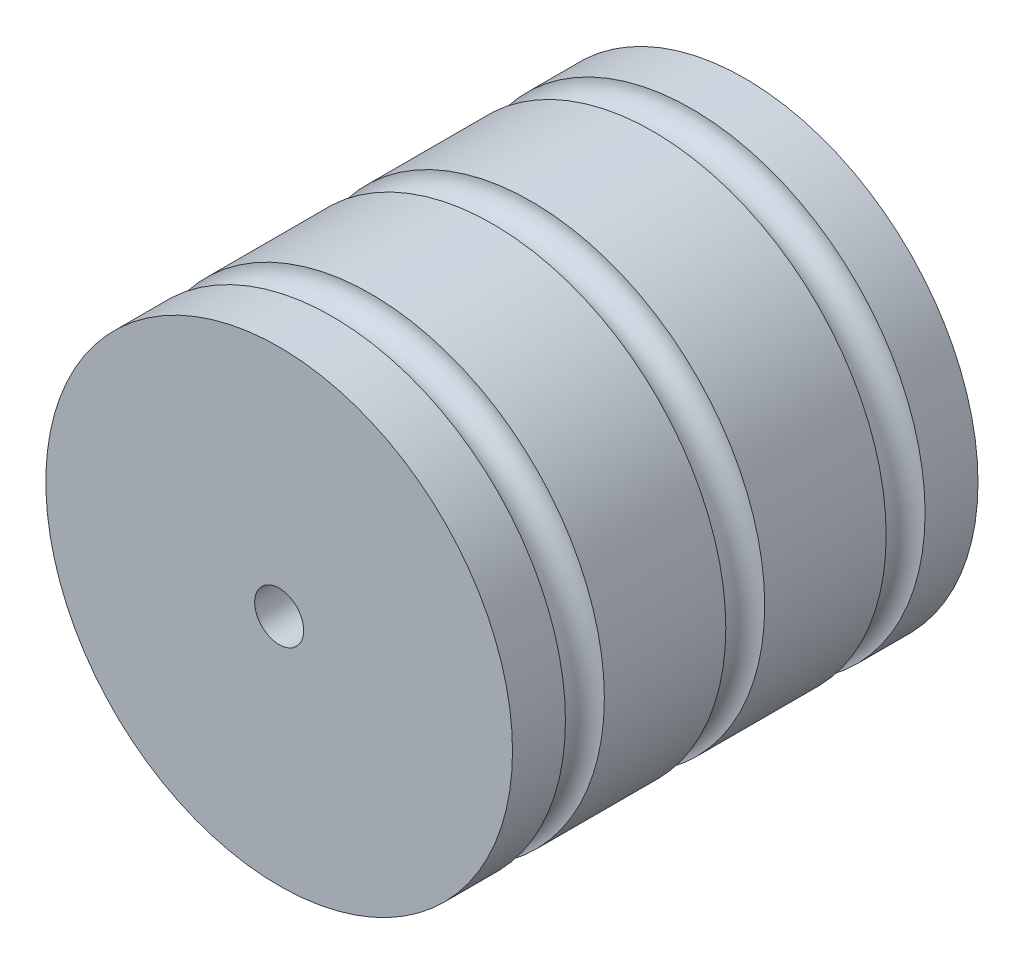
ISO-10303-21;
HEADER;
FILE_DESCRIPTION(('STEP AP214'),'2;1');
FILE_NAME('part.step','',(''),(''),'','','');
FILE_SCHEMA(('AUTOMOTIVE_DESIGN { 1 0 10303 214 1 1 1 1 }'));
ENDSEC;
DATA;
#1=APPLICATION_CONTEXT('core data for automotive mechanical design processes');
#2=APPLICATION_PROTOCOL_DEFINITION('international standard','automotive_design',2000,#1);
#3=PRODUCT_CONTEXT('',#1,'mechanical');
#4=PRODUCT('Part','Part','',(#3));
#5=PRODUCT_RELATED_PRODUCT_CATEGORY('part','',(#4));
#6=PRODUCT_DEFINITION_FORMATION('','',#4);
#7=PRODUCT_DEFINITION_CONTEXT('part definition',#1,'design');
#8=PRODUCT_DEFINITION('design','',#6,#7);
#9=PRODUCT_DEFINITION_SHAPE('','',#8);
#10=(LENGTH_UNIT() NAMED_UNIT(*) SI_UNIT(.MILLI.,.METRE.));
#11=(NAMED_UNIT(*) PLANE_ANGLE_UNIT() SI_UNIT($,.RADIAN.));
#12=(NAMED_UNIT(*) SI_UNIT($,.STERADIAN.) SOLID_ANGLE_UNIT());
#13=UNCERTAINTY_MEASURE_WITH_UNIT(LENGTH_MEASURE(1.E-05),#10,'distance_accuracy_value','');
#14=(GEOMETRIC_REPRESENTATION_CONTEXT(3) GLOBAL_UNCERTAINTY_ASSIGNED_CONTEXT((#13)) GLOBAL_UNIT_ASSIGNED_CONTEXT((#10,
#11,#12)) REPRESENTATION_CONTEXT('',''));
#15=CARTESIAN_POINT('',(0.,0.,0.));
#16=DIRECTION('',(0.,0.,1.));
#17=DIRECTION('',(1.,0.,0.));
#18=AXIS2_PLACEMENT_3D('',#15,#16,#17);
#19=CARTESIAN_POINT('',(0.,0.,0.));
#20=DIRECTION('',(0.,0.,1.));
#21=DIRECTION('',(1.,0.,0.));
#22=AXIS2_PLACEMENT_3D('',#19,#20,#21);
#23=CYLINDRICAL_SURFACE('',#22,38.1);
#24=CARTESIAN_POINT('',(0.,0.,-76.));
#25=DIRECTION('',(0.,0.,1.));
#26=DIRECTION('',(1.,0.,0.));
#27=AXIS2_PLACEMENT_3D('',#24,#25,#26);
#28=CIRCLE('',#27,38.1);
#29=CARTESIAN_POINT('',(38.1,0.,-76.));
#30=VERTEX_POINT('',#29);
#31=EDGE_CURVE('E10',#30,#30,#28,.T.);
#32=ORIENTED_EDGE('',*,*,#31,.T.);
#33=EDGE_LOOP('',(#32));
#34=FACE_BOUND('',#33,.T.);
#35=CARTESIAN_POINT('',(0.,0.,-67.3578022588215));
#36=DIRECTION('',(0.,0.,1.));
#37=DIRECTION('',(1.,0.,0.));
#38=AXIS2_PLACEMENT_3D('',#35,#36,#37);
#39=CIRCLE('',#38,38.1);
#40=CARTESIAN_POINT('',(38.1,0.,-67.3578022588215));
#41=VERTEX_POINT('',#40);
#42=EDGE_CURVE('E65',#41,#41,#39,.T.);
#43=ORIENTED_EDGE('',*,*,#42,.F.);
#44=EDGE_LOOP('',(#43));
#45=FACE_BOUND('',#44,.T.);
#46=ADVANCED_FACE('F31',(#34,#45),#23,.T.);
#47=CARTESIAN_POINT('',(4.,0.,-76.));
#48=DIRECTION('',(0.,0.,-1.));
#49=DIRECTION('',(-1.,0.,0.));
#50=AXIS2_PLACEMENT_3D('',#47,#48,#49);
#51=PLANE('',#50);
#52=CARTESIAN_POINT('',(0.,0.,-76.));
#53=DIRECTION('',(0.,0.,1.));
#54=DIRECTION('',(1.,0.,0.));
#55=AXIS2_PLACEMENT_3D('',#52,#53,#54);
#56=CIRCLE('',#55,4.);
#57=CARTESIAN_POINT('',(4.,0.,-76.));
#58=VERTEX_POINT('',#57);
#59=EDGE_CURVE('E37',#58,#58,#56,.T.);
#60=ORIENTED_EDGE('',*,*,#59,.T.);
#61=EDGE_LOOP('',(#60));
#62=FACE_BOUND('',#61,.T.);
#63=ORIENTED_EDGE('',*,*,#31,.F.);
#64=EDGE_LOOP('',(#63));
#65=FACE_BOUND('',#64,.T.);
#66=ADVANCED_FACE('F73',(#62,#65),#51,.T.);
#67=CARTESIAN_POINT('',(0.,0.,0.));
#68=DIRECTION('',(0.,0.,1.));
#69=DIRECTION('',(1.,0.,0.));
#70=AXIS2_PLACEMENT_3D('',#67,#68,#69);
#71=CYLINDRICAL_SURFACE('',#70,4.00000000000001);
#72=CARTESIAN_POINT('',(0.,0.,0.));
#73=DIRECTION('',(0.,0.,1.));
#74=DIRECTION('',(1.,0.,0.));
#75=AXIS2_PLACEMENT_3D('',#72,#73,#74);
#76=CIRCLE('',#75,4.00000000000001);
#77=CARTESIAN_POINT('',(4.00000000000001,0.,0.));
#78=VERTEX_POINT('',#77);
#79=EDGE_CURVE('E41',#78,#78,#76,.T.);
#80=ORIENTED_EDGE('',*,*,#79,.T.);
#81=EDGE_LOOP('',(#80));
#82=FACE_BOUND('',#81,.T.);
#83=ORIENTED_EDGE('',*,*,#59,.F.);
#84=EDGE_LOOP('',(#83));
#85=FACE_BOUND('',#84,.T.);
#86=ADVANCED_FACE('F77',(#82,#85),#71,.F.);
#87=CARTESIAN_POINT('',(4.00000000000001,0.,0.));
#88=DIRECTION('',(0.,0.,1.));
#89=DIRECTION('',(1.,0.,0.));
#90=AXIS2_PLACEMENT_3D('',#87,#88,#89);
#91=PLANE('',#90);
#92=CARTESIAN_POINT('',(0.,0.,0.));
#93=DIRECTION('',(0.,0.,1.));
#94=DIRECTION('',(1.,0.,0.));
#95=AXIS2_PLACEMENT_3D('',#92,#93,#94);
#96=CIRCLE('',#95,38.1);
#97=CARTESIAN_POINT('',(38.1,0.,0.));
#98=VERTEX_POINT('',#97);
#99=EDGE_CURVE('E45',#98,#98,#96,.T.);
#100=ORIENTED_EDGE('',*,*,#99,.T.);
#101=EDGE_LOOP('',(#100));
#102=FACE_BOUND('',#101,.T.);
#103=ORIENTED_EDGE('',*,*,#79,.F.);
#104=EDGE_LOOP('',(#103));
#105=FACE_BOUND('',#104,.T.);
#106=ADVANCED_FACE('F81',(#102,#105),#91,.T.);
#107=CARTESIAN_POINT('',(0.,0.,0.));
#108=DIRECTION('',(0.,0.,1.));
#109=DIRECTION('',(1.,0.,0.));
#110=AXIS2_PLACEMENT_3D('',#107,#108,#109);
#111=CYLINDRICAL_SURFACE('',#110,38.1);
#112=CARTESIAN_POINT('',(0.,0.,-8.64219774117848));
#113=DIRECTION('',(0.,0.,1.));
#114=DIRECTION('',(1.,0.,0.));
#115=AXIS2_PLACEMENT_3D('',#112,#113,#114);
#116=CIRCLE('',#115,38.1);
#117=CARTESIAN_POINT('',(38.1,0.,-8.64219774117848));
#118=VERTEX_POINT('',#117);
#119=EDGE_CURVE('E50',#118,#118,#116,.T.);
#120=ORIENTED_EDGE('',*,*,#119,.T.);
#121=EDGE_LOOP('',(#120));
#122=FACE_BOUND('',#121,.T.);
#123=ORIENTED_EDGE('',*,*,#99,.F.);
#124=EDGE_LOOP('',(#123));
#125=FACE_BOUND('',#124,.T.);
#126=ADVANCED_FACE('F88',(#122,#125),#111,.T.);
#127=CARTESIAN_POINT('',(0.,0.,-11.8171977411785));
#128=DIRECTION('',(0.,0.,1.));
#129=DIRECTION('',(1.,0.,0.));
#130=AXIS2_PLACEMENT_3D('',#127,#128,#129);
#131=TOROIDAL_SURFACE('',#130,38.1,3.175);
#132=CARTESIAN_POINT('',(0.,0.,-14.9921977411785));
#133=DIRECTION('',(0.,0.,1.));
#134=DIRECTION('',(1.,0.,0.));
#135=AXIS2_PLACEMENT_3D('',#132,#133,#134);
#136=CIRCLE('',#135,38.1);
#137=CARTESIAN_POINT('',(38.1,0.,-14.9921977411785));
#138=VERTEX_POINT('',#137);
#139=EDGE_CURVE('E53',#138,#138,#136,.T.);
#140=ORIENTED_EDGE('',*,*,#139,.T.);
#141=EDGE_LOOP('',(#140));
#142=FACE_BOUND('',#141,.T.);
#143=ORIENTED_EDGE('',*,*,#119,.F.);
#144=EDGE_LOOP('',(#143));
#145=FACE_BOUND('',#144,.T.);
#146=ADVANCED_FACE('F92',(#142,#145),#131,.F.);
#147=CARTESIAN_POINT('',(0.,0.,0.));
#148=DIRECTION('',(0.,0.,1.));
#149=DIRECTION('',(1.,0.,0.));
#150=AXIS2_PLACEMENT_3D('',#147,#148,#149);
#151=CYLINDRICAL_SURFACE('',#150,38.1);
#152=CARTESIAN_POINT('',(0.,0.,-34.825));
#153=DIRECTION('',(0.,0.,1.));
#154=DIRECTION('',(1.,0.,0.));
#155=AXIS2_PLACEMENT_3D('',#152,#153,#154);
#156=CIRCLE('',#155,38.1);
#157=CARTESIAN_POINT('',(38.1,0.,-34.825));
#158=VERTEX_POINT('',#157);
#159=EDGE_CURVE('E56',#158,#158,#156,.T.);
#160=ORIENTED_EDGE('',*,*,#159,.T.);
#161=EDGE_LOOP('',(#160));
#162=FACE_BOUND('',#161,.T.);
#163=ORIENTED_EDGE('',*,*,#139,.F.);
#164=EDGE_LOOP('',(#163));
#165=FACE_BOUND('',#164,.T.);
#166=ADVANCED_FACE('F96',(#162,#165),#151,.T.);
#167=CARTESIAN_POINT('',(0.,0.,-38.));
#168=DIRECTION('',(0.,0.,1.));
#169=DIRECTION('',(1.,0.,0.));
#170=AXIS2_PLACEMENT_3D('',#167,#168,#169);
#171=TOROIDAL_SURFACE('',#170,38.1,3.175);
#172=CARTESIAN_POINT('',(0.,0.,-41.175));
#173=DIRECTION('',(0.,0.,1.));
#174=DIRECTION('',(1.,0.,0.));
#175=AXIS2_PLACEMENT_3D('',#172,#173,#174);
#176=CIRCLE('',#175,38.1);
#177=CARTESIAN_POINT('',(38.1,0.,-41.175));
#178=VERTEX_POINT('',#177);
#179=EDGE_CURVE('E59',#178,#178,#176,.T.);
#180=ORIENTED_EDGE('',*,*,#179,.T.);
#181=EDGE_LOOP('',(#180));
#182=FACE_BOUND('',#181,.T.);
#183=ORIENTED_EDGE('',*,*,#159,.F.);
#184=EDGE_LOOP('',(#183));
#185=FACE_BOUND('',#184,.T.);
#186=ADVANCED_FACE('F100',(#182,#185),#171,.F.);
#187=CARTESIAN_POINT('',(0.,0.,0.));
#188=DIRECTION('',(0.,0.,1.));
#189=DIRECTION('',(1.,0.,0.));
#190=AXIS2_PLACEMENT_3D('',#187,#188,#189);
#191=CYLINDRICAL_SURFACE('',#190,38.1);
#192=CARTESIAN_POINT('',(0.,0.,-61.0078022588215));
#193=DIRECTION('',(0.,0.,1.));
#194=DIRECTION('',(1.,0.,0.));
#195=AXIS2_PLACEMENT_3D('',#192,#193,#194);
#196=CIRCLE('',#195,38.1);
#197=CARTESIAN_POINT('',(38.1,0.,-61.0078022588215));
#198=VERTEX_POINT('',#197);
#199=EDGE_CURVE('E62',#198,#198,#196,.T.);
#200=ORIENTED_EDGE('',*,*,#199,.T.);
#201=EDGE_LOOP('',(#200));
#202=FACE_BOUND('',#201,.T.);
#203=ORIENTED_EDGE('',*,*,#179,.F.);
#204=EDGE_LOOP('',(#203));
#205=FACE_BOUND('',#204,.T.);
#206=ADVANCED_FACE('F104',(#202,#205),#191,.T.);
#207=CARTESIAN_POINT('',(0.,0.,-64.1828022588215));
#208=DIRECTION('',(0.,0.,1.));
#209=DIRECTION('',(1.,0.,0.));
#210=AXIS2_PLACEMENT_3D('',#207,#208,#209);
#211=TOROIDAL_SURFACE('',#210,38.1,3.175);
#212=ORIENTED_EDGE('',*,*,#42,.T.);
#213=EDGE_LOOP('',(#212));
#214=FACE_BOUND('',#213,.T.);
#215=ORIENTED_EDGE('',*,*,#199,.F.);
#216=EDGE_LOOP('',(#215));
#217=FACE_BOUND('',#216,.T.);
#218=ADVANCED_FACE('F69',(#214,#217),#211,.F.);
#219=CLOSED_SHELL('',(#46,#66,#86,#106,#126,#146,#166,#186,#206,#218));
#220=MANIFOLD_SOLID_BREP('B2',#219);
#221=ADVANCED_BREP_SHAPE_REPRESENTATION('',(#18,#220),#14);
#222=SHAPE_DEFINITION_REPRESENTATION(#9,#221);
ENDSEC;
END-ISO-10303-21;
